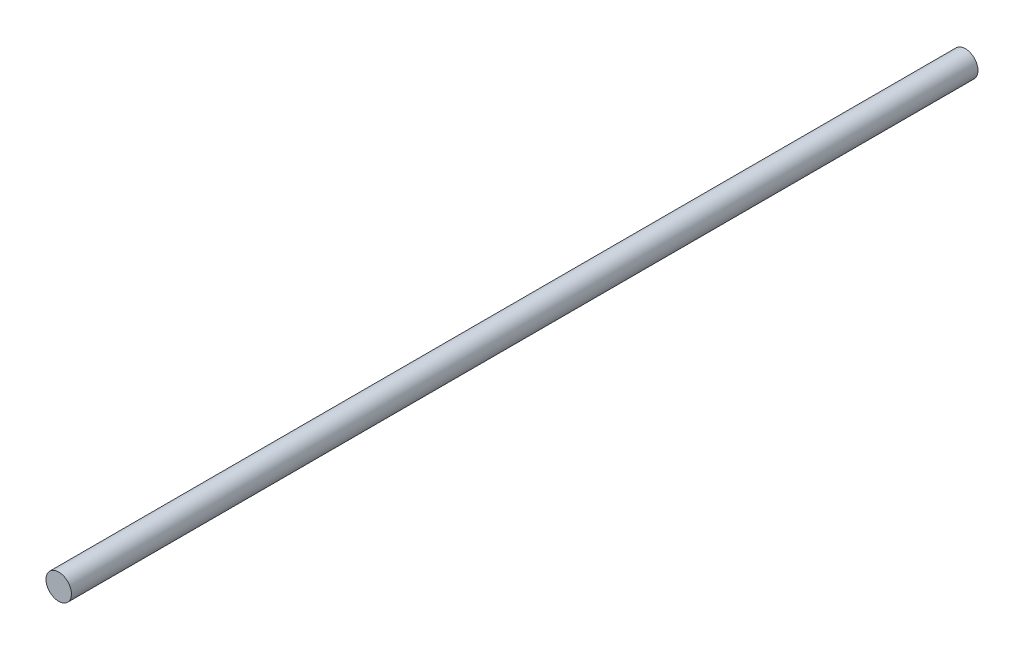
ISO-10303-21;
HEADER;
FILE_DESCRIPTION(('STEP AP214'),'2;1');
FILE_NAME('part.step','',(''),(''),'','','');
FILE_SCHEMA(('AUTOMOTIVE_DESIGN { 1 0 10303 214 1 1 1 1 }'));
ENDSEC;
DATA;
#1=APPLICATION_CONTEXT('core data for automotive mechanical design processes');
#2=APPLICATION_PROTOCOL_DEFINITION('international standard','automotive_design',2000,#1);
#3=PRODUCT_CONTEXT('',#1,'mechanical');
#4=PRODUCT('Part','Part','',(#3));
#5=PRODUCT_RELATED_PRODUCT_CATEGORY('part','',(#4));
#6=PRODUCT_DEFINITION_FORMATION('','',#4);
#7=PRODUCT_DEFINITION_CONTEXT('part definition',#1,'design');
#8=PRODUCT_DEFINITION('design','',#6,#7);
#9=PRODUCT_DEFINITION_SHAPE('','',#8);
#10=(LENGTH_UNIT() NAMED_UNIT(*) SI_UNIT(.MILLI.,.METRE.));
#11=(NAMED_UNIT(*) PLANE_ANGLE_UNIT() SI_UNIT($,.RADIAN.));
#12=(NAMED_UNIT(*) SI_UNIT($,.STERADIAN.) SOLID_ANGLE_UNIT());
#13=UNCERTAINTY_MEASURE_WITH_UNIT(LENGTH_MEASURE(1.E-05),#10,'distance_accuracy_value','');
#14=(GEOMETRIC_REPRESENTATION_CONTEXT(3) GLOBAL_UNCERTAINTY_ASSIGNED_CONTEXT((#13)) GLOBAL_UNIT_ASSIGNED_CONTEXT((#10,
#11,#12)) REPRESENTATION_CONTEXT('',''));
#15=CARTESIAN_POINT('',(0.,0.,0.));
#16=DIRECTION('',(0.,0.,1.));
#17=DIRECTION('',(1.,0.,0.));
#18=AXIS2_PLACEMENT_3D('',#15,#16,#17);
#19=CARTESIAN_POINT('',(0.,0.,150.));
#20=DIRECTION('',(0.,0.,-1.));
#21=DIRECTION('',(-1.,0.,0.));
#22=AXIS2_PLACEMENT_3D('',#19,#20,#21);
#23=CYLINDRICAL_SURFACE('',#22,2.105);
#24=CARTESIAN_POINT('',(0.,0.,150.));
#25=DIRECTION('',(0.,0.,1.));
#26=DIRECTION('',(1.,0.,0.));
#27=AXIS2_PLACEMENT_3D('',#24,#25,#26);
#28=CIRCLE('',#27,2.105);
#29=CARTESIAN_POINT('',(2.105,0.,150.));
#30=VERTEX_POINT('',#29);
#31=EDGE_CURVE('E10',#30,#30,#28,.T.);
#32=ORIENTED_EDGE('',*,*,#31,.F.);
#33=EDGE_LOOP('',(#32));
#34=FACE_BOUND('',#33,.T.);
#35=CARTESIAN_POINT('',(0.,0.,0.));
#36=DIRECTION('',(0.,0.,1.));
#37=DIRECTION('',(1.,0.,0.));
#38=AXIS2_PLACEMENT_3D('',#35,#36,#37);
#39=CIRCLE('',#38,2.105);
#40=CARTESIAN_POINT('',(2.105,0.,0.));
#41=VERTEX_POINT('',#40);
#42=EDGE_CURVE('E34',#41,#41,#39,.T.);
#43=ORIENTED_EDGE('',*,*,#42,.T.);
#44=EDGE_LOOP('',(#43));
#45=FACE_BOUND('',#44,.T.);
#46=ADVANCED_FACE('F31',(#34,#45),#23,.T.);
#47=CARTESIAN_POINT('',(0.,0.,150.));
#48=DIRECTION('',(0.,0.,1.));
#49=DIRECTION('',(1.,0.,0.));
#50=AXIS2_PLACEMENT_3D('',#47,#48,#49);
#51=PLANE('',#50);
#52=ORIENTED_EDGE('',*,*,#31,.T.);
#53=EDGE_LOOP('',(#52));
#54=FACE_BOUND('',#53,.T.);
#55=ADVANCED_FACE('F46',(#54),#51,.T.);
#56=CARTESIAN_POINT('',(0.,0.,0.));
#57=DIRECTION('',(0.,0.,1.));
#58=DIRECTION('',(1.,0.,0.));
#59=AXIS2_PLACEMENT_3D('',#56,#57,#58);
#60=PLANE('',#59);
#61=ORIENTED_EDGE('',*,*,#42,.F.);
#62=EDGE_LOOP('',(#61));
#63=FACE_BOUND('',#62,.T.);
#64=ADVANCED_FACE('F44',(#63),#60,.F.);
#65=CLOSED_SHELL('',(#46,#55,#64));
#66=MANIFOLD_SOLID_BREP('B2',#65);
#67=ADVANCED_BREP_SHAPE_REPRESENTATION('',(#18,#66),#14);
#68=SHAPE_DEFINITION_REPRESENTATION(#9,#67);
ENDSEC;
END-ISO-10303-21;
